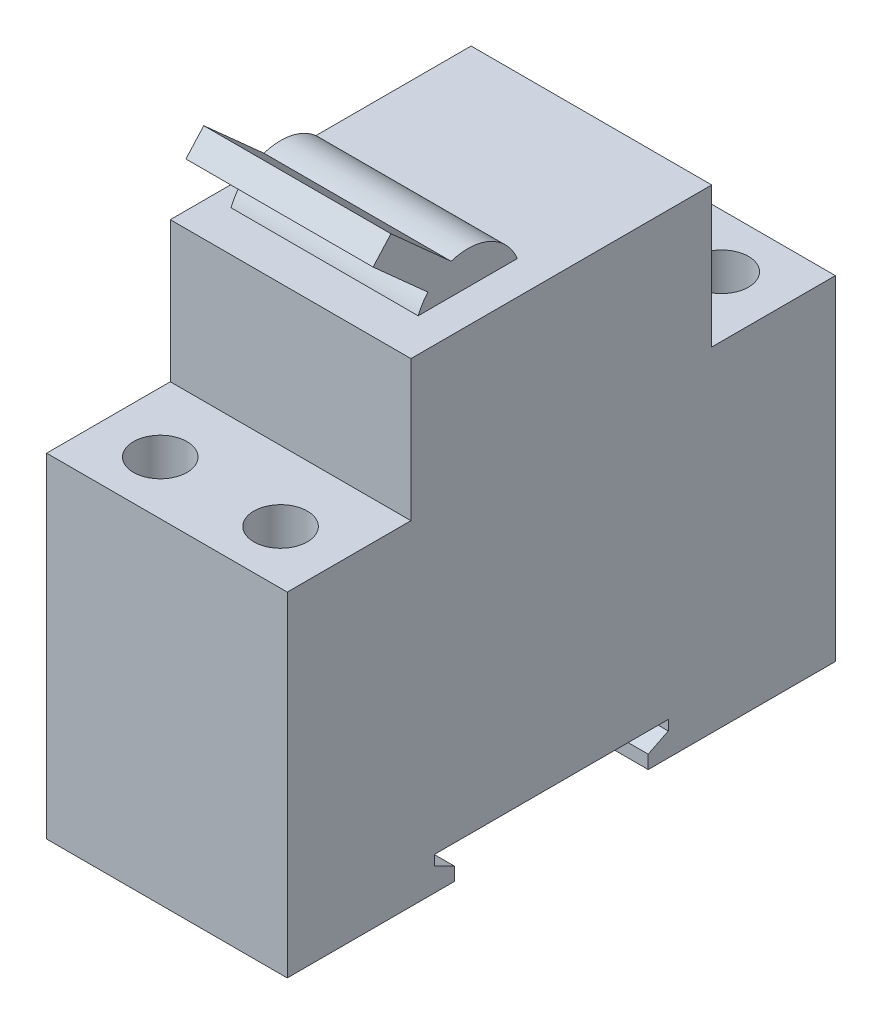
ISO-10303-21;
HEADER;
FILE_DESCRIPTION(('STEP AP214'),'2;1');
FILE_NAME('part.step','',(''),(''),'','','');
FILE_SCHEMA(('AUTOMOTIVE_DESIGN { 1 0 10303 214 1 1 1 1 }'));
ENDSEC;
DATA;
#1=APPLICATION_CONTEXT('core data for automotive mechanical design processes');
#2=APPLICATION_PROTOCOL_DEFINITION('international standard','automotive_design',2000,#1);
#3=PRODUCT_CONTEXT('',#1,'mechanical');
#4=PRODUCT('Part','Part','',(#3));
#5=PRODUCT_RELATED_PRODUCT_CATEGORY('part','',(#4));
#6=PRODUCT_DEFINITION_FORMATION('','',#4);
#7=PRODUCT_DEFINITION_CONTEXT('part definition',#1,'design');
#8=PRODUCT_DEFINITION('design','',#6,#7);
#9=PRODUCT_DEFINITION_SHAPE('','',#8);
#10=(LENGTH_UNIT() NAMED_UNIT(*) SI_UNIT(.MILLI.,.METRE.));
#11=(NAMED_UNIT(*) PLANE_ANGLE_UNIT() SI_UNIT($,.RADIAN.));
#12=(NAMED_UNIT(*) SI_UNIT($,.STERADIAN.) SOLID_ANGLE_UNIT());
#13=UNCERTAINTY_MEASURE_WITH_UNIT(LENGTH_MEASURE(1.E-05),#10,'distance_accuracy_value','');
#14=(GEOMETRIC_REPRESENTATION_CONTEXT(3) GLOBAL_UNCERTAINTY_ASSIGNED_CONTEXT((#13)) GLOBAL_UNIT_ASSIGNED_CONTEXT((#10,
#11,#12)) REPRESENTATION_CONTEXT('',''));
#15=CARTESIAN_POINT('',(0.,0.,0.));
#16=DIRECTION('',(0.,0.,1.));
#17=DIRECTION('',(1.,0.,0.));
#18=AXIS2_PLACEMENT_3D('',#15,#16,#17);
#19=CARTESIAN_POINT('',(36.,71.,-18.5));
#20=DIRECTION('',(0.,-1.,0.));
#21=DIRECTION('',(0.,0.,-1.));
#22=AXIS2_PLACEMENT_3D('',#19,#20,#21);
#23=PLANE('',#22);
#24=DIRECTION('',(0.,0.,1.));
#25=VECTOR('',#24,1.);
#26=CARTESIAN_POINT('',(0.,71.,-18.5));
#27=LINE('',#26,#25);
#28=CARTESIAN_POINT('',(0.,71.,-63.5));
#29=VERTEX_POINT('',#28);
#30=CARTESIAN_POINT('',(0.,71.,-18.5));
#31=VERTEX_POINT('',#30);
#32=EDGE_CURVE('E251',#29,#31,#27,.T.);
#33=ORIENTED_EDGE('',*,*,#32,.T.);
#34=DIRECTION('',(-1.,0.,0.));
#35=VECTOR('',#34,1.);
#36=CARTESIAN_POINT('',(36.,71.,-18.5));
#37=LINE('',#36,#35);
#38=CARTESIAN_POINT('',(36.,71.,-18.5));
#39=VERTEX_POINT('',#38);
#40=EDGE_CURVE('E299',#39,#31,#37,.T.);
#41=ORIENTED_EDGE('',*,*,#40,.F.);
#42=DIRECTION('',(0.,0.,1.));
#43=VECTOR('',#42,1.);
#44=CARTESIAN_POINT('',(36.,71.,-18.5));
#45=LINE('',#44,#43);
#46=CARTESIAN_POINT('',(36.,71.,-63.5));
#47=VERTEX_POINT('',#46);
#48=EDGE_CURVE('E283',#47,#39,#45,.T.);
#49=ORIENTED_EDGE('',*,*,#48,.F.);
#50=DIRECTION('',(-1.,0.,0.));
#51=VECTOR('',#50,1.);
#52=CARTESIAN_POINT('',(36.,71.,-63.5));
#53=LINE('',#52,#51);
#54=EDGE_CURVE('E302',#47,#29,#53,.T.);
#55=ORIENTED_EDGE('',*,*,#54,.T.);
#56=EDGE_LOOP('',(#33,#41,#49,#55));
#57=FACE_BOUND('',#56,.T.);
#58=DIRECTION('',(0.,0.,-1.));
#59=VECTOR('',#58,1.);
#60=CARTESIAN_POINT('',(31.,71.,-18.5));
#61=LINE('',#60,#59);
#62=CARTESIAN_POINT('',(31.,71.,-24.5838015129043));
#63=VERTEX_POINT('',#62);
#64=CARTESIAN_POINT('',(31.,71.,-39.4161984870957));
#65=VERTEX_POINT('',#64);
#66=EDGE_CURVE('E11',#63,#65,#61,.T.);
#67=ORIENTED_EDGE('',*,*,#66,.F.);
#68=DIRECTION('',(-1.,0.,0.));
#69=VECTOR('',#68,1.);
#70=CARTESIAN_POINT('',(31.,71.,-24.5838015129043));
#71=LINE('',#70,#69);
#72=CARTESIAN_POINT('',(3.,71.,-24.5838015129043));
#73=VERTEX_POINT('',#72);
#74=EDGE_CURVE('E41',#73,#63,#71,.F.);
#75=ORIENTED_EDGE('',*,*,#74,.F.);
#76=DIRECTION('',(0.,0.,-1.));
#77=VECTOR('',#76,1.);
#78=CARTESIAN_POINT('',(3.,71.,-18.5));
#79=LINE('',#78,#77);
#80=CARTESIAN_POINT('',(3.,71.,-39.4161984870957));
#81=VERTEX_POINT('',#80);
#82=EDGE_CURVE('E338',#73,#81,#79,.T.);
#83=ORIENTED_EDGE('',*,*,#82,.T.);
#84=DIRECTION('',(-1.,0.,0.));
#85=VECTOR('',#84,1.);
#86=CARTESIAN_POINT('',(31.,71.,-39.4161984870957));
#87=LINE('',#86,#85);
#88=EDGE_CURVE('E187',#65,#81,#87,.T.);
#89=ORIENTED_EDGE('',*,*,#88,.F.);
#90=EDGE_LOOP('',(#67,#75,#83,#89));
#91=FACE_BOUND('',#90,.T.);
#92=ADVANCED_FACE('F33',(#57,#91),#23,.F.);
#93=CARTESIAN_POINT('',(36.,0.,0.));
#94=DIRECTION('',(0.,1.,0.));
#95=DIRECTION('',(0.,0.,1.));
#96=AXIS2_PLACEMENT_3D('',#93,#94,#95);
#97=PLANE('',#96);
#98=DIRECTION('',(0.,0.,-1.));
#99=VECTOR('',#98,1.);
#100=CARTESIAN_POINT('',(0.,0.,0.));
#101=LINE('',#100,#99);
#102=CARTESIAN_POINT('',(0.,0.,0.));
#103=VERTEX_POINT('',#102);
#104=CARTESIAN_POINT('',(0.,0.,-25.));
#105=VERTEX_POINT('',#104);
#106=EDGE_CURVE('E197',#103,#105,#101,.T.);
#107=ORIENTED_EDGE('',*,*,#106,.T.);
#108=DIRECTION('',(-1.,0.,0.));
#109=VECTOR('',#108,1.);
#110=CARTESIAN_POINT('',(36.,0.,-25.));
#111=LINE('',#110,#109);
#112=CARTESIAN_POINT('',(36.,0.,-25.));
#113=VERTEX_POINT('',#112);
#114=EDGE_CURVE('E335',#113,#105,#111,.T.);
#115=ORIENTED_EDGE('',*,*,#114,.F.);
#116=DIRECTION('',(0.,0.,-1.));
#117=VECTOR('',#116,1.);
#118=CARTESIAN_POINT('',(36.,0.,0.));
#119=LINE('',#118,#117);
#120=CARTESIAN_POINT('',(36.,0.,0.));
#121=VERTEX_POINT('',#120);
#122=EDGE_CURVE('E259',#121,#113,#119,.T.);
#123=ORIENTED_EDGE('',*,*,#122,.F.);
#124=DIRECTION('',(-1.,0.,0.));
#125=VECTOR('',#124,1.);
#126=CARTESIAN_POINT('',(36.,0.,0.));
#127=LINE('',#126,#125);
#128=EDGE_CURVE('E290',#121,#103,#127,.T.);
#129=ORIENTED_EDGE('',*,*,#128,.T.);
#130=EDGE_LOOP('',(#107,#115,#123,#129));
#131=FACE_BOUND('',#130,.T.);
#132=ADVANCED_FACE('F35',(#131),#97,.F.);
#133=CARTESIAN_POINT('',(36.,0.,-25.));
#134=DIRECTION('',(0.,0.,1.));
#135=DIRECTION('',(1.,0.,0.));
#136=AXIS2_PLACEMENT_3D('',#133,#134,#135);
#137=PLANE('',#136);
#138=DIRECTION('',(0.,1.,0.));
#139=VECTOR('',#138,1.);
#140=CARTESIAN_POINT('',(0.,0.,-25.));
#141=LINE('',#140,#139);
#142=CARTESIAN_POINT('',(0.,2.,-25.));
#143=VERTEX_POINT('',#142);
#144=EDGE_CURVE('E229',#105,#143,#141,.T.);
#145=ORIENTED_EDGE('',*,*,#144,.T.);
#146=DIRECTION('',(-1.,0.,0.));
#147=VECTOR('',#146,1.);
#148=CARTESIAN_POINT('',(36.,2.,-25.));
#149=LINE('',#148,#147);
#150=CARTESIAN_POINT('',(36.,2.,-25.));
#151=VERTEX_POINT('',#150);
#152=EDGE_CURVE('E332',#151,#143,#149,.T.);
#153=ORIENTED_EDGE('',*,*,#152,.F.);
#154=DIRECTION('',(0.,1.,0.));
#155=VECTOR('',#154,1.);
#156=CARTESIAN_POINT('',(36.,0.,-25.));
#157=LINE('',#156,#155);
#158=EDGE_CURVE('E261',#113,#151,#157,.T.);
#159=ORIENTED_EDGE('',*,*,#158,.F.);
#160=ORIENTED_EDGE('',*,*,#114,.T.);
#161=EDGE_LOOP('',(#145,#153,#159,#160));
#162=FACE_BOUND('',#161,.T.);
#163=ADVANCED_FACE('F452',(#162),#137,.F.);
#164=CARTESIAN_POINT('',(36.,2.,-25.));
#165=DIRECTION('',(0.,-0.894427190999916,0.447213595499958));
#166=DIRECTION('',(0.,-0.447213595499958,-0.894427190999916));
#167=AXIS2_PLACEMENT_3D('',#164,#165,#166);
#168=PLANE('',#167);
#169=DIRECTION('',(0.,0.447213595499958,0.894427190999916));
#170=VECTOR('',#169,1.);
#171=CARTESIAN_POINT('',(0.,2.,-25.));
#172=LINE('',#171,#170);
#173=CARTESIAN_POINT('',(0.,3.5,-22.));
#174=VERTEX_POINT('',#173);
#175=EDGE_CURVE('E231',#143,#174,#172,.T.);
#176=ORIENTED_EDGE('',*,*,#175,.T.);
#177=DIRECTION('',(-1.,0.,0.));
#178=VECTOR('',#177,1.);
#179=CARTESIAN_POINT('',(36.,3.5,-22.));
#180=LINE('',#179,#178);
#181=CARTESIAN_POINT('',(36.,3.5,-22.));
#182=VERTEX_POINT('',#181);
#183=EDGE_CURVE('E329',#182,#174,#180,.T.);
#184=ORIENTED_EDGE('',*,*,#183,.F.);
#185=DIRECTION('',(0.,0.447213595499958,0.894427190999916));
#186=VECTOR('',#185,1.);
#187=CARTESIAN_POINT('',(36.,2.,-25.));
#188=LINE('',#187,#186);
#189=EDGE_CURVE('E263',#151,#182,#188,.T.);
#190=ORIENTED_EDGE('',*,*,#189,.F.);
#191=ORIENTED_EDGE('',*,*,#152,.T.);
#192=EDGE_LOOP('',(#176,#184,#190,#191));
#193=FACE_BOUND('',#192,.T.);
#194=ADVANCED_FACE('F448',(#193),#168,.F.);
#195=CARTESIAN_POINT('',(36.,3.5,-22.));
#196=DIRECTION('',(0.,0.,1.));
#197=DIRECTION('',(1.,0.,0.));
#198=AXIS2_PLACEMENT_3D('',#195,#196,#197);
#199=PLANE('',#198);
#200=DIRECTION('',(0.,1.,0.));
#201=VECTOR('',#200,1.);
#202=CARTESIAN_POINT('',(0.,3.5,-22.));
#203=LINE('',#202,#201);
#204=CARTESIAN_POINT('',(0.,5.,-22.));
#205=VERTEX_POINT('',#204);
#206=EDGE_CURVE('E233',#174,#205,#203,.T.);
#207=ORIENTED_EDGE('',*,*,#206,.T.);
#208=DIRECTION('',(-1.,0.,0.));
#209=VECTOR('',#208,1.);
#210=CARTESIAN_POINT('',(36.,5.,-22.));
#211=LINE('',#210,#209);
#212=CARTESIAN_POINT('',(36.,5.,-22.));
#213=VERTEX_POINT('',#212);
#214=EDGE_CURVE('E326',#213,#205,#211,.T.);
#215=ORIENTED_EDGE('',*,*,#214,.F.);
#216=DIRECTION('',(0.,1.,0.));
#217=VECTOR('',#216,1.);
#218=CARTESIAN_POINT('',(36.,3.5,-22.));
#219=LINE('',#218,#217);
#220=EDGE_CURVE('E265',#182,#213,#219,.T.);
#221=ORIENTED_EDGE('',*,*,#220,.F.);
#222=ORIENTED_EDGE('',*,*,#183,.T.);
#223=EDGE_LOOP('',(#207,#215,#221,#222));
#224=FACE_BOUND('',#223,.T.);
#225=ADVANCED_FACE('F444',(#224),#199,.F.);
#226=CARTESIAN_POINT('',(36.,5.,-22.));
#227=DIRECTION('',(0.,1.,0.));
#228=DIRECTION('',(0.,0.,1.));
#229=AXIS2_PLACEMENT_3D('',#226,#227,#228);
#230=PLANE('',#229);
#231=DIRECTION('',(0.,0.,-1.));
#232=VECTOR('',#231,1.);
#233=CARTESIAN_POINT('',(0.,5.,-22.));
#234=LINE('',#233,#232);
#235=CARTESIAN_POINT('',(0.,5.,-57.));
#236=VERTEX_POINT('',#235);
#237=EDGE_CURVE('E235',#205,#236,#234,.T.);
#238=ORIENTED_EDGE('',*,*,#237,.T.);
#239=DIRECTION('',(-1.,0.,0.));
#240=VECTOR('',#239,1.);
#241=CARTESIAN_POINT('',(36.,5.,-57.));
#242=LINE('',#241,#240);
#243=CARTESIAN_POINT('',(36.,5.,-57.));
#244=VERTEX_POINT('',#243);
#245=EDGE_CURVE('E323',#244,#236,#242,.T.);
#246=ORIENTED_EDGE('',*,*,#245,.F.);
#247=DIRECTION('',(0.,0.,-1.));
#248=VECTOR('',#247,1.);
#249=CARTESIAN_POINT('',(36.,5.,-22.));
#250=LINE('',#249,#248);
#251=EDGE_CURVE('E267',#213,#244,#250,.T.);
#252=ORIENTED_EDGE('',*,*,#251,.F.);
#253=ORIENTED_EDGE('',*,*,#214,.T.);
#254=EDGE_LOOP('',(#238,#246,#252,#253));
#255=FACE_BOUND('',#254,.T.);
#256=ADVANCED_FACE('F440',(#255),#230,.F.);
#257=CARTESIAN_POINT('',(36.,5.,-57.));
#258=DIRECTION('',(0.,0.,-1.));
#259=DIRECTION('',(0.,1.,0.));
#260=AXIS2_PLACEMENT_3D('',#257,#258,#259);
#261=PLANE('',#260);
#262=DIRECTION('',(0.,-1.,0.));
#263=VECTOR('',#262,1.);
#264=CARTESIAN_POINT('',(0.,5.,-57.));
#265=LINE('',#264,#263);
#266=CARTESIAN_POINT('',(0.,3.49999999999997,-57.));
#267=VERTEX_POINT('',#266);
#268=EDGE_CURVE('E237',#236,#267,#265,.T.);
#269=ORIENTED_EDGE('',*,*,#268,.T.);
#270=DIRECTION('',(-1.,0.,0.));
#271=VECTOR('',#270,1.);
#272=CARTESIAN_POINT('',(36.,3.49999999999997,-57.));
#273=LINE('',#272,#271);
#274=CARTESIAN_POINT('',(36.,3.49999999999997,-57.));
#275=VERTEX_POINT('',#274);
#276=EDGE_CURVE('E320',#275,#267,#273,.T.);
#277=ORIENTED_EDGE('',*,*,#276,.F.);
#278=DIRECTION('',(0.,-1.,0.));
#279=VECTOR('',#278,1.);
#280=CARTESIAN_POINT('',(36.,5.,-57.));
#281=LINE('',#280,#279);
#282=EDGE_CURVE('E269',#244,#275,#281,.T.);
#283=ORIENTED_EDGE('',*,*,#282,.F.);
#284=ORIENTED_EDGE('',*,*,#245,.T.);
#285=EDGE_LOOP('',(#269,#277,#283,#284));
#286=FACE_BOUND('',#285,.T.);
#287=ADVANCED_FACE('F435',(#286),#261,.F.);
#288=CARTESIAN_POINT('',(36.,3.49999999999997,-57.));
#289=DIRECTION('',(0.,-0.89442719099992,-0.447213595499949));
#290=DIRECTION('',(0.,0.447213595499949,-0.894427190999921));
#291=AXIS2_PLACEMENT_3D('',#288,#289,#290);
#292=PLANE('',#291);
#293=DIRECTION('',(0.,-0.447213595499949,0.89442719099992));
#294=VECTOR('',#293,1.);
#295=CARTESIAN_POINT('',(0.,3.49999999999997,-57.));
#296=LINE('',#295,#294);
#297=CARTESIAN_POINT('',(0.,2.,-54.));
#298=VERTEX_POINT('',#297);
#299=EDGE_CURVE('E239',#267,#298,#296,.T.);
#300=ORIENTED_EDGE('',*,*,#299,.T.);
#301=DIRECTION('',(-1.,0.,0.));
#302=VECTOR('',#301,1.);
#303=CARTESIAN_POINT('',(36.,2.,-54.));
#304=LINE('',#303,#302);
#305=CARTESIAN_POINT('',(36.,2.,-54.));
#306=VERTEX_POINT('',#305);
#307=EDGE_CURVE('E317',#306,#298,#304,.T.);
#308=ORIENTED_EDGE('',*,*,#307,.F.);
#309=DIRECTION('',(0.,-0.447213595499949,0.89442719099992));
#310=VECTOR('',#309,1.);
#311=CARTESIAN_POINT('',(36.,3.49999999999997,-57.));
#312=LINE('',#311,#310);
#313=EDGE_CURVE('E271',#275,#306,#312,.T.);
#314=ORIENTED_EDGE('',*,*,#313,.F.);
#315=ORIENTED_EDGE('',*,*,#276,.T.);
#316=EDGE_LOOP('',(#300,#308,#314,#315));
#317=FACE_BOUND('',#316,.T.);
#318=ADVANCED_FACE('F429',(#317),#292,.F.);
#319=CARTESIAN_POINT('',(36.,2.,-54.));
#320=DIRECTION('',(0.,0.,-1.));
#321=DIRECTION('',(0.,1.,0.));
#322=AXIS2_PLACEMENT_3D('',#319,#320,#321);
#323=PLANE('',#322);
#324=DIRECTION('',(0.,-1.,0.));
#325=VECTOR('',#324,1.);
#326=CARTESIAN_POINT('',(0.,2.,-54.));
#327=LINE('',#326,#325);
#328=CARTESIAN_POINT('',(0.,0.,-54.));
#329=VERTEX_POINT('',#328);
#330=EDGE_CURVE('E241',#298,#329,#327,.T.);
#331=ORIENTED_EDGE('',*,*,#330,.T.);
#332=DIRECTION('',(-1.,0.,0.));
#333=VECTOR('',#332,1.);
#334=CARTESIAN_POINT('',(36.,0.,-54.));
#335=LINE('',#334,#333);
#336=CARTESIAN_POINT('',(36.,0.,-54.));
#337=VERTEX_POINT('',#336);
#338=EDGE_CURVE('E314',#337,#329,#335,.T.);
#339=ORIENTED_EDGE('',*,*,#338,.F.);
#340=DIRECTION('',(0.,-1.,0.));
#341=VECTOR('',#340,1.);
#342=CARTESIAN_POINT('',(36.,2.,-54.));
#343=LINE('',#342,#341);
#344=EDGE_CURVE('E273',#306,#337,#343,.T.);
#345=ORIENTED_EDGE('',*,*,#344,.F.);
#346=ORIENTED_EDGE('',*,*,#307,.T.);
#347=EDGE_LOOP('',(#331,#339,#345,#346));
#348=FACE_BOUND('',#347,.T.);
#349=ADVANCED_FACE('F425',(#348),#323,.F.);
#350=CARTESIAN_POINT('',(36.,0.,-82.));
#351=DIRECTION('',(0.,1.,0.));
#352=DIRECTION('',(0.,0.,1.));
#353=AXIS2_PLACEMENT_3D('',#350,#351,#352);
#354=PLANE('',#353);
#355=DIRECTION('',(0.,0.,-1.));
#356=VECTOR('',#355,1.);
#357=CARTESIAN_POINT('',(0.,0.,-82.));
#358=LINE('',#357,#356);
#359=CARTESIAN_POINT('',(0.,0.,-82.));
#360=VERTEX_POINT('',#359);
#361=EDGE_CURVE('E243',#329,#360,#358,.T.);
#362=ORIENTED_EDGE('',*,*,#361,.T.);
#363=DIRECTION('',(-1.,0.,0.));
#364=VECTOR('',#363,1.);
#365=CARTESIAN_POINT('',(36.,0.,-82.));
#366=LINE('',#365,#364);
#367=CARTESIAN_POINT('',(36.,0.,-82.));
#368=VERTEX_POINT('',#367);
#369=EDGE_CURVE('E311',#368,#360,#366,.T.);
#370=ORIENTED_EDGE('',*,*,#369,.F.);
#371=DIRECTION('',(0.,0.,-1.));
#372=VECTOR('',#371,1.);
#373=CARTESIAN_POINT('',(36.,0.,-82.));
#374=LINE('',#373,#372);
#375=EDGE_CURVE('E275',#337,#368,#374,.T.);
#376=ORIENTED_EDGE('',*,*,#375,.F.);
#377=ORIENTED_EDGE('',*,*,#338,.T.);
#378=EDGE_LOOP('',(#362,#370,#376,#377));
#379=FACE_BOUND('',#378,.T.);
#380=ADVANCED_FACE('F421',(#379),#354,.F.);
#381=CARTESIAN_POINT('',(36.,50.,-82.));
#382=DIRECTION('',(0.,0.,1.));
#383=DIRECTION('',(0.,-1.,0.));
#384=AXIS2_PLACEMENT_3D('',#381,#382,#383);
#385=PLANE('',#384);
#386=DIRECTION('',(0.,1.,0.));
#387=VECTOR('',#386,1.);
#388=CARTESIAN_POINT('',(0.,50.,-82.));
#389=LINE('',#388,#387);
#390=CARTESIAN_POINT('',(0.,50.,-82.));
#391=VERTEX_POINT('',#390);
#392=EDGE_CURVE('E245',#360,#391,#389,.T.);
#393=ORIENTED_EDGE('',*,*,#392,.T.);
#394=DIRECTION('',(-1.,0.,0.));
#395=VECTOR('',#394,1.);
#396=CARTESIAN_POINT('',(36.,50.,-82.));
#397=LINE('',#396,#395);
#398=CARTESIAN_POINT('',(36.,50.,-82.));
#399=VERTEX_POINT('',#398);
#400=EDGE_CURVE('E308',#399,#391,#397,.T.);
#401=ORIENTED_EDGE('',*,*,#400,.F.);
#402=DIRECTION('',(0.,1.,0.));
#403=VECTOR('',#402,1.);
#404=CARTESIAN_POINT('',(36.,50.,-82.));
#405=LINE('',#404,#403);
#406=EDGE_CURVE('E277',#368,#399,#405,.T.);
#407=ORIENTED_EDGE('',*,*,#406,.F.);
#408=ORIENTED_EDGE('',*,*,#369,.T.);
#409=EDGE_LOOP('',(#393,#401,#407,#408));
#410=FACE_BOUND('',#409,.T.);
#411=ADVANCED_FACE('F384',(#410),#385,.F.);
#412=CARTESIAN_POINT('',(36.,50.,-63.5));
#413=DIRECTION('',(0.,-1.,0.));
#414=DIRECTION('',(0.,0.,-1.));
#415=AXIS2_PLACEMENT_3D('',#412,#413,#414);
#416=PLANE('',#415);
#417=CARTESIAN_POINT('',(27.,50.,-74.));
#418=DIRECTION('',(0.,1.,0.));
#419=DIRECTION('',(0.,0.,1.));
#420=AXIS2_PLACEMENT_3D('',#417,#418,#419);
#421=CIRCLE('',#420,4.);
#422=CARTESIAN_POINT('',(27.,50.,-70.));
#423=VERTEX_POINT('',#422);
#424=EDGE_CURVE('E374',#423,#423,#421,.T.);
#425=ORIENTED_EDGE('',*,*,#424,.F.);
#426=EDGE_LOOP('',(#425));
#427=FACE_BOUND('',#426,.T.);
#428=CARTESIAN_POINT('',(9.,50.,-74.));
#429=DIRECTION('',(0.,1.,0.));
#430=DIRECTION('',(0.,0.,1.));
#431=AXIS2_PLACEMENT_3D('',#428,#429,#430);
#432=CIRCLE('',#431,4.00000000000001);
#433=CARTESIAN_POINT('',(9.,50.,-70.));
#434=VERTEX_POINT('',#433);
#435=EDGE_CURVE('E368',#434,#434,#432,.T.);
#436=ORIENTED_EDGE('',*,*,#435,.F.);
#437=EDGE_LOOP('',(#436));
#438=FACE_BOUND('',#437,.T.);
#439=DIRECTION('',(0.,0.,1.));
#440=VECTOR('',#439,1.);
#441=CARTESIAN_POINT('',(0.,50.,-63.5));
#442=LINE('',#441,#440);
#443=CARTESIAN_POINT('',(0.,50.,-63.5));
#444=VERTEX_POINT('',#443);
#445=EDGE_CURVE('E247',#391,#444,#442,.T.);
#446=ORIENTED_EDGE('',*,*,#445,.T.);
#447=DIRECTION('',(-1.,0.,0.));
#448=VECTOR('',#447,1.);
#449=CARTESIAN_POINT('',(36.,50.,-63.5));
#450=LINE('',#449,#448);
#451=CARTESIAN_POINT('',(36.,50.,-63.5));
#452=VERTEX_POINT('',#451);
#453=EDGE_CURVE('E305',#452,#444,#450,.T.);
#454=ORIENTED_EDGE('',*,*,#453,.F.);
#455=DIRECTION('',(0.,0.,1.));
#456=VECTOR('',#455,1.);
#457=CARTESIAN_POINT('',(36.,50.,-63.5));
#458=LINE('',#457,#456);
#459=EDGE_CURVE('E279',#399,#452,#458,.T.);
#460=ORIENTED_EDGE('',*,*,#459,.F.);
#461=ORIENTED_EDGE('',*,*,#400,.T.);
#462=EDGE_LOOP('',(#446,#454,#460,#461));
#463=FACE_BOUND('',#462,.T.);
#464=ADVANCED_FACE('F380',(#427,#438,#463),#416,.F.);
#465=CARTESIAN_POINT('',(36.,71.,-63.5));
#466=DIRECTION('',(0.,0.,1.));
#467=DIRECTION('',(1.,0.,0.));
#468=AXIS2_PLACEMENT_3D('',#465,#466,#467);
#469=PLANE('',#468);
#470=DIRECTION('',(0.,1.,0.));
#471=VECTOR('',#470,1.);
#472=CARTESIAN_POINT('',(0.,71.,-63.5));
#473=LINE('',#472,#471);
#474=EDGE_CURVE('E249',#444,#29,#473,.T.);
#475=ORIENTED_EDGE('',*,*,#474,.T.);
#476=ORIENTED_EDGE('',*,*,#54,.F.);
#477=DIRECTION('',(0.,1.,0.));
#478=VECTOR('',#477,1.);
#479=CARTESIAN_POINT('',(36.,71.,-63.5));
#480=LINE('',#479,#478);
#481=EDGE_CURVE('E281',#452,#47,#480,.T.);
#482=ORIENTED_EDGE('',*,*,#481,.F.);
#483=ORIENTED_EDGE('',*,*,#453,.T.);
#484=EDGE_LOOP('',(#475,#476,#482,#483));
#485=FACE_BOUND('',#484,.T.);
#486=ADVANCED_FACE('F383',(#485),#469,.F.);
#487=CARTESIAN_POINT('',(36.,50.,-18.5));
#488=DIRECTION('',(0.,0.,-1.));
#489=DIRECTION('',(-1.,0.,0.));
#490=AXIS2_PLACEMENT_3D('',#487,#488,#489);
#491=PLANE('',#490);
#492=DIRECTION('',(0.,-1.,0.));
#493=VECTOR('',#492,1.);
#494=CARTESIAN_POINT('',(0.,50.,-18.5));
#495=LINE('',#494,#493);
#496=CARTESIAN_POINT('',(0.,50.,-18.5));
#497=VERTEX_POINT('',#496);
#498=EDGE_CURVE('E253',#31,#497,#495,.T.);
#499=ORIENTED_EDGE('',*,*,#498,.T.);
#500=DIRECTION('',(-1.,0.,0.));
#501=VECTOR('',#500,1.);
#502=CARTESIAN_POINT('',(36.,50.,-18.5));
#503=LINE('',#502,#501);
#504=CARTESIAN_POINT('',(36.,50.,-18.5));
#505=VERTEX_POINT('',#504);
#506=EDGE_CURVE('E296',#505,#497,#503,.T.);
#507=ORIENTED_EDGE('',*,*,#506,.F.);
#508=DIRECTION('',(0.,-1.,0.));
#509=VECTOR('',#508,1.);
#510=CARTESIAN_POINT('',(36.,50.,-18.5));
#511=LINE('',#510,#509);
#512=EDGE_CURVE('E285',#39,#505,#511,.T.);
#513=ORIENTED_EDGE('',*,*,#512,.F.);
#514=ORIENTED_EDGE('',*,*,#40,.T.);
#515=EDGE_LOOP('',(#499,#507,#513,#514));
#516=FACE_BOUND('',#515,.T.);
#517=ADVANCED_FACE('F408',(#516),#491,.F.);
#518=CARTESIAN_POINT('',(36.,50.,0.));
#519=DIRECTION('',(0.,-1.,0.));
#520=DIRECTION('',(0.,0.,-1.));
#521=AXIS2_PLACEMENT_3D('',#518,#519,#520);
#522=PLANE('',#521);
#523=CARTESIAN_POINT('',(27.,50.,-8.));
#524=DIRECTION('',(0.,1.,0.));
#525=DIRECTION('',(0.,0.,1.));
#526=AXIS2_PLACEMENT_3D('',#523,#524,#525);
#527=CIRCLE('',#526,4.);
#528=CARTESIAN_POINT('',(27.,50.,-4.));
#529=VERTEX_POINT('',#528);
#530=EDGE_CURVE('E362',#529,#529,#527,.T.);
#531=ORIENTED_EDGE('',*,*,#530,.F.);
#532=EDGE_LOOP('',(#531));
#533=FACE_BOUND('',#532,.T.);
#534=CARTESIAN_POINT('',(9.,50.,-8.));
#535=DIRECTION('',(0.,1.,0.));
#536=DIRECTION('',(0.,0.,1.));
#537=AXIS2_PLACEMENT_3D('',#534,#535,#536);
#538=CIRCLE('',#537,4.);
#539=CARTESIAN_POINT('',(9.,50.,-4.));
#540=VERTEX_POINT('',#539);
#541=EDGE_CURVE('E354',#540,#540,#538,.T.);
#542=ORIENTED_EDGE('',*,*,#541,.F.);
#543=EDGE_LOOP('',(#542));
#544=FACE_BOUND('',#543,.T.);
#545=DIRECTION('',(0.,0.,1.));
#546=VECTOR('',#545,1.);
#547=CARTESIAN_POINT('',(0.,50.,0.));
#548=LINE('',#547,#546);
#549=CARTESIAN_POINT('',(0.,50.,0.));
#550=VERTEX_POINT('',#549);
#551=EDGE_CURVE('E255',#497,#550,#548,.T.);
#552=ORIENTED_EDGE('',*,*,#551,.T.);
#553=DIRECTION('',(-1.,0.,0.));
#554=VECTOR('',#553,1.);
#555=CARTESIAN_POINT('',(36.,50.,0.));
#556=LINE('',#555,#554);
#557=CARTESIAN_POINT('',(36.,50.,0.));
#558=VERTEX_POINT('',#557);
#559=EDGE_CURVE('E293',#558,#550,#556,.T.);
#560=ORIENTED_EDGE('',*,*,#559,.F.);
#561=DIRECTION('',(0.,0.,1.));
#562=VECTOR('',#561,1.);
#563=CARTESIAN_POINT('',(36.,50.,0.));
#564=LINE('',#563,#562);
#565=EDGE_CURVE('E287',#505,#558,#564,.T.);
#566=ORIENTED_EDGE('',*,*,#565,.F.);
#567=ORIENTED_EDGE('',*,*,#506,.T.);
#568=EDGE_LOOP('',(#552,#560,#566,#567));
#569=FACE_BOUND('',#568,.T.);
#570=ADVANCED_FACE('F460',(#533,#544,#569),#522,.F.);
#571=CARTESIAN_POINT('',(36.,0.,0.));
#572=DIRECTION('',(0.,0.,-1.));
#573=DIRECTION('',(-1.,0.,0.));
#574=AXIS2_PLACEMENT_3D('',#571,#572,#573);
#575=PLANE('',#574);
#576=DIRECTION('',(0.,-1.,0.));
#577=VECTOR('',#576,1.);
#578=CARTESIAN_POINT('',(0.,0.,0.));
#579=LINE('',#578,#577);
#580=EDGE_CURVE('E257',#550,#103,#579,.T.);
#581=ORIENTED_EDGE('',*,*,#580,.T.);
#582=ORIENTED_EDGE('',*,*,#128,.F.);
#583=DIRECTION('',(0.,-1.,0.));
#584=VECTOR('',#583,1.);
#585=CARTESIAN_POINT('',(36.,0.,0.));
#586=LINE('',#585,#584);
#587=EDGE_CURVE('E56',#558,#121,#586,.T.);
#588=ORIENTED_EDGE('',*,*,#587,.F.);
#589=ORIENTED_EDGE('',*,*,#559,.T.);
#590=EDGE_LOOP('',(#581,#582,#588,#589));
#591=FACE_BOUND('',#590,.T.);
#592=ADVANCED_FACE('F458',(#591),#575,.F.);
#593=CARTESIAN_POINT('',(36.,0.,-25.));
#594=DIRECTION('',(1.,0.,0.));
#595=DIRECTION('',(0.,0.,-1.));
#596=AXIS2_PLACEMENT_3D('',#593,#594,#595);
#597=PLANE('',#596);
#598=ORIENTED_EDGE('',*,*,#122,.T.);
#599=ORIENTED_EDGE('',*,*,#158,.T.);
#600=ORIENTED_EDGE('',*,*,#189,.T.);
#601=ORIENTED_EDGE('',*,*,#220,.T.);
#602=ORIENTED_EDGE('',*,*,#251,.T.);
#603=ORIENTED_EDGE('',*,*,#282,.T.);
#604=ORIENTED_EDGE('',*,*,#313,.T.);
#605=ORIENTED_EDGE('',*,*,#344,.T.);
#606=ORIENTED_EDGE('',*,*,#375,.T.);
#607=ORIENTED_EDGE('',*,*,#406,.T.);
#608=ORIENTED_EDGE('',*,*,#459,.T.);
#609=ORIENTED_EDGE('',*,*,#481,.T.);
#610=ORIENTED_EDGE('',*,*,#48,.T.);
#611=ORIENTED_EDGE('',*,*,#512,.T.);
#612=ORIENTED_EDGE('',*,*,#565,.T.);
#613=ORIENTED_EDGE('',*,*,#587,.T.);
#614=EDGE_LOOP('',(#598,#599,#600,#601,#602,#603,#604,#605,#606,#607,#608,#609,#610,#611,#612,#613));
#615=FACE_BOUND('',#614,.T.);
#616=ADVANCED_FACE('F411',(#615),#597,.T.);
#617=CARTESIAN_POINT('',(0.,0.,-25.));
#618=DIRECTION('',(1.,0.,0.));
#619=DIRECTION('',(0.,0.,-1.));
#620=AXIS2_PLACEMENT_3D('',#617,#618,#619);
#621=PLANE('',#620);
#622=ORIENTED_EDGE('',*,*,#106,.F.);
#623=ORIENTED_EDGE('',*,*,#580,.F.);
#624=ORIENTED_EDGE('',*,*,#551,.F.);
#625=ORIENTED_EDGE('',*,*,#498,.F.);
#626=ORIENTED_EDGE('',*,*,#32,.F.);
#627=ORIENTED_EDGE('',*,*,#474,.F.);
#628=ORIENTED_EDGE('',*,*,#445,.F.);
#629=ORIENTED_EDGE('',*,*,#392,.F.);
#630=ORIENTED_EDGE('',*,*,#361,.F.);
#631=ORIENTED_EDGE('',*,*,#330,.F.);
#632=ORIENTED_EDGE('',*,*,#299,.F.);
#633=ORIENTED_EDGE('',*,*,#268,.F.);
#634=ORIENTED_EDGE('',*,*,#237,.F.);
#635=ORIENTED_EDGE('',*,*,#206,.F.);
#636=ORIENTED_EDGE('',*,*,#175,.F.);
#637=ORIENTED_EDGE('',*,*,#144,.F.);
#638=EDGE_LOOP('',(#622,#623,#624,#625,#626,#627,#628,#629,#630,#631,#632,#633,#634,#635,#636,#637));
#639=FACE_BOUND('',#638,.T.);
#640=ADVANCED_FACE('F400',(#639),#621,.F.);
#641=CARTESIAN_POINT('',(31.,68.,-32.));
#642=DIRECTION('',(-1.,0.,0.));
#643=DIRECTION('',(0.,0.,1.));
#644=AXIS2_PLACEMENT_3D('',#641,#642,#643);
#645=CYLINDRICAL_SURFACE('',#644,8.);
#646=CARTESIAN_POINT('',(3.,68.,-32.));
#647=DIRECTION('',(1.,0.,0.));
#648=DIRECTION('',(0.,0.,1.));
#649=AXIS2_PLACEMENT_3D('',#646,#647,#648);
#650=CIRCLE('',#649,8.);
#651=CARTESIAN_POINT('',(3.,73.3389073003454,-26.0421422609868));
#652=VERTEX_POINT('',#651);
#653=EDGE_CURVE('E190',#652,#73,#650,.T.);
#654=ORIENTED_EDGE('',*,*,#653,.T.);
#655=ORIENTED_EDGE('',*,*,#74,.T.);
#656=CARTESIAN_POINT('',(31.,68.,-32.));
#657=DIRECTION('',(1.,0.,0.));
#658=DIRECTION('',(0.,0.,1.));
#659=AXIS2_PLACEMENT_3D('',#656,#657,#658);
#660=CIRCLE('',#659,8.);
#661=CARTESIAN_POINT('',(31.,73.3389073003454,-26.0421422609868));
#662=VERTEX_POINT('',#661);
#663=EDGE_CURVE('E210',#662,#63,#660,.T.);
#664=ORIENTED_EDGE('',*,*,#663,.F.);
#665=DIRECTION('',(-1.,0.,0.));
#666=VECTOR('',#665,1.);
#667=CARTESIAN_POINT('',(31.,73.3389073003454,-26.0421422609868));
#668=LINE('',#667,#666);
#669=EDGE_CURVE('E220',#662,#652,#668,.T.);
#670=ORIENTED_EDGE('',*,*,#669,.T.);
#671=EDGE_LOOP('',(#654,#655,#664,#670));
#672=FACE_BOUND('',#671,.T.);
#673=ADVANCED_FACE('F344',(#672),#645,.T.);
#674=CARTESIAN_POINT('',(31.,68.,-32.));
#675=DIRECTION('',(-1.,0.,0.));
#676=DIRECTION('',(0.,0.,1.));
#677=AXIS2_PLACEMENT_3D('',#674,#675,#676);
#678=CYLINDRICAL_SURFACE('',#677,8.);
#679=CARTESIAN_POINT('',(31.,68.,-32.));
#680=DIRECTION('',(1.,0.,0.));
#681=DIRECTION('',(0.,0.,1.));
#682=AXIS2_PLACEMENT_3D('',#679,#680,#681);
#683=CIRCLE('',#682,8.);
#684=CARTESIAN_POINT('',(31.,75.6034687241735,-29.5125789740143));
#685=VERTEX_POINT('',#684);
#686=EDGE_CURVE('E213',#65,#685,#683,.T.);
#687=ORIENTED_EDGE('',*,*,#686,.F.);
#688=ORIENTED_EDGE('',*,*,#88,.T.);
#689=CARTESIAN_POINT('',(3.,68.,-32.));
#690=DIRECTION('',(1.,0.,0.));
#691=DIRECTION('',(0.,0.,1.));
#692=AXIS2_PLACEMENT_3D('',#689,#690,#691);
#693=CIRCLE('',#692,8.);
#694=CARTESIAN_POINT('',(3.,75.6034687241735,-29.5125789740143));
#695=VERTEX_POINT('',#694);
#696=EDGE_CURVE('E48',#81,#695,#693,.T.);
#697=ORIENTED_EDGE('',*,*,#696,.T.);
#698=DIRECTION('',(-1.,0.,0.));
#699=VECTOR('',#698,1.);
#700=CARTESIAN_POINT('',(31.,75.6034687241735,-29.5125789740143));
#701=LINE('',#700,#699);
#702=EDGE_CURVE('E184',#685,#695,#701,.T.);
#703=ORIENTED_EDGE('',*,*,#702,.F.);
#704=EDGE_LOOP('',(#687,#688,#697,#703));
#705=FACE_BOUND('',#704,.T.);
#706=ADVANCED_FACE('F183',(#705),#678,.T.);
#707=CARTESIAN_POINT('',(31.,68.,-32.));
#708=DIRECTION('',(-1.,0.,0.));
#709=DIRECTION('',(0.,0.,1.));
#710=AXIS2_PLACEMENT_3D('',#707,#708,#709);
#711=PLANE('',#710);
#712=ORIENTED_EDGE('',*,*,#663,.T.);
#713=ORIENTED_EDGE('',*,*,#66,.T.);
#714=ORIENTED_EDGE('',*,*,#686,.T.);
#715=DIRECTION('',(0.,0.66736341254317,0.744732217376645));
#716=VECTOR('',#715,1.);
#717=CARTESIAN_POINT('',(31.,83.6700984890429,-20.5107683283655));
#718=LINE('',#717,#716);
#719=CARTESIAN_POINT('',(31.,83.6700984890429,-20.5107683283655));
#720=VERTEX_POINT('',#719);
#721=EDGE_CURVE('E196',#685,#720,#718,.T.);
#722=ORIENTED_EDGE('',*,*,#721,.T.);
#723=DIRECTION('',(0.,-0.744732217376645,0.66736341254317));
#724=VECTOR('',#723,1.);
#725=CARTESIAN_POINT('',(31.,80.6892822160993,-17.8396233534868));
#726=LINE('',#725,#724);
#727=CARTESIAN_POINT('',(31.,80.6892822160993,-17.8396233534868));
#728=VERTEX_POINT('',#727);
#729=EDGE_CURVE('E216',#720,#728,#726,.T.);
#730=ORIENTED_EDGE('',*,*,#729,.T.);
#731=DIRECTION('',(0.,-0.66736341254317,-0.744732217376645));
#732=VECTOR('',#731,1.);
#733=CARTESIAN_POINT('',(31.,73.3389073003454,-26.0421422609868));
#734=LINE('',#733,#732);
#735=EDGE_CURVE('E218',#728,#662,#734,.T.);
#736=ORIENTED_EDGE('',*,*,#735,.T.);
#737=EDGE_LOOP('',(#712,#713,#714,#722,#730,#736));
#738=FACE_BOUND('',#737,.T.);
#739=ADVANCED_FACE('F349',(#738),#711,.F.);
#740=CARTESIAN_POINT('',(3.,68.,-32.));
#741=DIRECTION('',(-1.,0.,0.));
#742=DIRECTION('',(0.,0.,1.));
#743=AXIS2_PLACEMENT_3D('',#740,#741,#742);
#744=PLANE('',#743);
#745=ORIENTED_EDGE('',*,*,#82,.F.);
#746=ORIENTED_EDGE('',*,*,#653,.F.);
#747=DIRECTION('',(0.,-0.66736341254317,-0.744732217376645));
#748=VECTOR('',#747,1.);
#749=CARTESIAN_POINT('',(3.,73.3389073003454,-26.0421422609868));
#750=LINE('',#749,#748);
#751=CARTESIAN_POINT('',(3.,80.6892822160993,-17.8396233534868));
#752=VERTEX_POINT('',#751);
#753=EDGE_CURVE('E205',#752,#652,#750,.T.);
#754=ORIENTED_EDGE('',*,*,#753,.F.);
#755=DIRECTION('',(0.,-0.744732217376645,0.66736341254317));
#756=VECTOR('',#755,1.);
#757=CARTESIAN_POINT('',(3.,80.6892822160993,-17.8396233534868));
#758=LINE('',#757,#756);
#759=CARTESIAN_POINT('',(3.,83.6700984890429,-20.5107683283655));
#760=VERTEX_POINT('',#759);
#761=EDGE_CURVE('E203',#760,#752,#758,.T.);
#762=ORIENTED_EDGE('',*,*,#761,.F.);
#763=DIRECTION('',(0.,0.66736341254317,0.744732217376645));
#764=VECTOR('',#763,1.);
#765=CARTESIAN_POINT('',(3.,83.6700984890429,-20.5107683283655));
#766=LINE('',#765,#764);
#767=EDGE_CURVE('E189',#695,#760,#766,.T.);
#768=ORIENTED_EDGE('',*,*,#767,.F.);
#769=ORIENTED_EDGE('',*,*,#696,.F.);
#770=EDGE_LOOP('',(#745,#746,#754,#762,#768,#769));
#771=FACE_BOUND('',#770,.T.);
#772=ADVANCED_FACE('F201',(#771),#744,.T.);
#773=CARTESIAN_POINT('',(31.,83.6700984890429,-20.5107683283655));
#774=DIRECTION('',(0.,-0.744732217376645,0.66736341254317));
#775=DIRECTION('',(0.,-0.66736341254317,-0.744732217376645));
#776=AXIS2_PLACEMENT_3D('',#773,#774,#775);
#777=PLANE('',#776);
#778=ORIENTED_EDGE('',*,*,#767,.T.);
#779=DIRECTION('',(-1.,0.,0.));
#780=VECTOR('',#779,1.);
#781=CARTESIAN_POINT('',(31.,83.6700984890429,-20.5107683283655));
#782=LINE('',#781,#780);
#783=EDGE_CURVE('E198',#720,#760,#782,.T.);
#784=ORIENTED_EDGE('',*,*,#783,.F.);
#785=ORIENTED_EDGE('',*,*,#721,.F.);
#786=ORIENTED_EDGE('',*,*,#702,.T.);
#787=EDGE_LOOP('',(#778,#784,#785,#786));
#788=FACE_BOUND('',#787,.T.);
#789=ADVANCED_FACE('F193',(#788),#777,.F.);
#790=CARTESIAN_POINT('',(31.,80.6892822160993,-17.8396233534868));
#791=DIRECTION('',(0.,-0.66736341254317,-0.744732217376645));
#792=DIRECTION('',(0.,0.744732217376645,-0.66736341254317));
#793=AXIS2_PLACEMENT_3D('',#790,#791,#792);
#794=PLANE('',#793);
#795=ORIENTED_EDGE('',*,*,#761,.T.);
#796=DIRECTION('',(-1.,0.,0.));
#797=VECTOR('',#796,1.);
#798=CARTESIAN_POINT('',(31.,80.6892822160993,-17.8396233534868));
#799=LINE('',#798,#797);
#800=EDGE_CURVE('E223',#728,#752,#799,.T.);
#801=ORIENTED_EDGE('',*,*,#800,.F.);
#802=ORIENTED_EDGE('',*,*,#729,.F.);
#803=ORIENTED_EDGE('',*,*,#783,.T.);
#804=EDGE_LOOP('',(#795,#801,#802,#803));
#805=FACE_BOUND('',#804,.T.);
#806=ADVANCED_FACE('F612',(#805),#794,.F.);
#807=CARTESIAN_POINT('',(31.,73.3389073003454,-26.0421422609868));
#808=DIRECTION('',(0.,0.744732217376645,-0.66736341254317));
#809=DIRECTION('',(0.,0.66736341254317,0.744732217376645));
#810=AXIS2_PLACEMENT_3D('',#807,#808,#809);
#811=PLANE('',#810);
#812=ORIENTED_EDGE('',*,*,#753,.T.);
#813=ORIENTED_EDGE('',*,*,#669,.F.);
#814=ORIENTED_EDGE('',*,*,#735,.F.);
#815=ORIENTED_EDGE('',*,*,#800,.T.);
#816=EDGE_LOOP('',(#812,#813,#814,#815));
#817=FACE_BOUND('',#816,.T.);
#818=ADVANCED_FACE('F621',(#817),#811,.F.);
#819=CARTESIAN_POINT('',(9.,40.,-8.));
#820=DIRECTION('',(0.,1.,0.));
#821=DIRECTION('',(0.,0.,1.));
#822=AXIS2_PLACEMENT_3D('',#819,#820,#821);
#823=CYLINDRICAL_SURFACE('',#822,4.);
#824=CARTESIAN_POINT('',(9.,40.,-8.));
#825=DIRECTION('',(0.,1.,0.));
#826=DIRECTION('',(0.,0.,1.));
#827=AXIS2_PLACEMENT_3D('',#824,#825,#826);
#828=CIRCLE('',#827,4.);
#829=CARTESIAN_POINT('',(9.,40.,-4.));
#830=VERTEX_POINT('',#829);
#831=EDGE_CURVE('E352',#830,#830,#828,.T.);
#832=ORIENTED_EDGE('',*,*,#831,.F.);
#833=EDGE_LOOP('',(#832));
#834=FACE_BOUND('',#833,.T.);
#835=ORIENTED_EDGE('',*,*,#541,.T.);
#836=EDGE_LOOP('',(#835));
#837=FACE_BOUND('',#836,.T.);
#838=ADVANCED_FACE('F631',(#834,#837),#823,.F.);
#839=CARTESIAN_POINT('',(9.,40.,-8.));
#840=DIRECTION('',(0.,1.,0.));
#841=DIRECTION('',(0.,0.,1.));
#842=AXIS2_PLACEMENT_3D('',#839,#840,#841);
#843=PLANE('',#842);
#844=ORIENTED_EDGE('',*,*,#831,.T.);
#845=EDGE_LOOP('',(#844));
#846=FACE_BOUND('',#845,.T.);
#847=ADVANCED_FACE('F641',(#846),#843,.T.);
#848=CARTESIAN_POINT('',(27.,40.,-8.));
#849=DIRECTION('',(0.,1.,0.));
#850=DIRECTION('',(0.,0.,1.));
#851=AXIS2_PLACEMENT_3D('',#848,#849,#850);
#852=CYLINDRICAL_SURFACE('',#851,4.);
#853=CARTESIAN_POINT('',(27.,40.,-8.));
#854=DIRECTION('',(0.,1.,0.));
#855=DIRECTION('',(0.,0.,1.));
#856=AXIS2_PLACEMENT_3D('',#853,#854,#855);
#857=CIRCLE('',#856,4.);
#858=CARTESIAN_POINT('',(27.,40.,-4.));
#859=VERTEX_POINT('',#858);
#860=EDGE_CURVE('E359',#859,#859,#857,.T.);
#861=ORIENTED_EDGE('',*,*,#860,.F.);
#862=EDGE_LOOP('',(#861));
#863=FACE_BOUND('',#862,.T.);
#864=ORIENTED_EDGE('',*,*,#530,.T.);
#865=EDGE_LOOP('',(#864));
#866=FACE_BOUND('',#865,.T.);
#867=ADVANCED_FACE('F651',(#863,#866),#852,.F.);
#868=CARTESIAN_POINT('',(27.,40.,-8.));
#869=DIRECTION('',(0.,1.,0.));
#870=DIRECTION('',(0.,0.,1.));
#871=AXIS2_PLACEMENT_3D('',#868,#869,#870);
#872=PLANE('',#871);
#873=ORIENTED_EDGE('',*,*,#860,.T.);
#874=EDGE_LOOP('',(#873));
#875=FACE_BOUND('',#874,.T.);
#876=ADVANCED_FACE('F661',(#875),#872,.T.);
#877=CARTESIAN_POINT('',(9.,40.,-74.));
#878=DIRECTION('',(0.,1.,0.));
#879=DIRECTION('',(0.,0.,1.));
#880=AXIS2_PLACEMENT_3D('',#877,#878,#879);
#881=CYLINDRICAL_SURFACE('',#880,4.00000000000001);
#882=CARTESIAN_POINT('',(9.,40.,-74.));
#883=DIRECTION('',(0.,1.,0.));
#884=DIRECTION('',(0.,0.,1.));
#885=AXIS2_PLACEMENT_3D('',#882,#883,#884);
#886=CIRCLE('',#885,4.00000000000001);
#887=CARTESIAN_POINT('',(9.,40.,-70.));
#888=VERTEX_POINT('',#887);
#889=EDGE_CURVE('E365',#888,#888,#886,.T.);
#890=ORIENTED_EDGE('',*,*,#889,.F.);
#891=EDGE_LOOP('',(#890));
#892=FACE_BOUND('',#891,.T.);
#893=ORIENTED_EDGE('',*,*,#435,.T.);
#894=EDGE_LOOP('',(#893));
#895=FACE_BOUND('',#894,.T.);
#896=ADVANCED_FACE('F671',(#892,#895),#881,.F.);
#897=CARTESIAN_POINT('',(9.,40.,-74.));
#898=DIRECTION('',(0.,1.,0.));
#899=DIRECTION('',(0.,0.,1.));
#900=AXIS2_PLACEMENT_3D('',#897,#898,#899);
#901=PLANE('',#900);
#902=ORIENTED_EDGE('',*,*,#889,.T.);
#903=EDGE_LOOP('',(#902));
#904=FACE_BOUND('',#903,.T.);
#905=ADVANCED_FACE('F681',(#904),#901,.T.);
#906=CARTESIAN_POINT('',(27.,40.,-74.));
#907=DIRECTION('',(0.,1.,0.));
#908=DIRECTION('',(0.,0.,1.));
#909=AXIS2_PLACEMENT_3D('',#906,#907,#908);
#910=CYLINDRICAL_SURFACE('',#909,4.);
#911=CARTESIAN_POINT('',(27.,40.,-74.));
#912=DIRECTION('',(0.,1.,0.));
#913=DIRECTION('',(0.,0.,1.));
#914=AXIS2_PLACEMENT_3D('',#911,#912,#913);
#915=CIRCLE('',#914,4.);
#916=CARTESIAN_POINT('',(27.,40.,-70.));
#917=VERTEX_POINT('',#916);
#918=EDGE_CURVE('E371',#917,#917,#915,.T.);
#919=ORIENTED_EDGE('',*,*,#918,.F.);
#920=EDGE_LOOP('',(#919));
#921=FACE_BOUND('',#920,.T.);
#922=ORIENTED_EDGE('',*,*,#424,.T.);
#923=EDGE_LOOP('',(#922));
#924=FACE_BOUND('',#923,.T.);
#925=ADVANCED_FACE('F378',(#921,#924),#910,.F.);
#926=CARTESIAN_POINT('',(27.,40.,-74.));
#927=DIRECTION('',(0.,1.,0.));
#928=DIRECTION('',(0.,0.,1.));
#929=AXIS2_PLACEMENT_3D('',#926,#927,#928);
#930=PLANE('',#929);
#931=ORIENTED_EDGE('',*,*,#918,.T.);
#932=EDGE_LOOP('',(#931));
#933=FACE_BOUND('',#932,.T.);
#934=ADVANCED_FACE('F700',(#933),#930,.T.);
#935=CLOSED_SHELL('',(#92,#132,#163,#194,#225,#256,#287,#318,#349,#380,#411,#464,#486,#517,#570,
#592,#616,#640,#673,#706,#739,#772,#789,#806,#818,#838,#847,#867,#876,#896,#905,#925,#934));
#936=MANIFOLD_SOLID_BREP('B2',#935);
#937=ADVANCED_BREP_SHAPE_REPRESENTATION('',(#18,#936),#14);
#938=SHAPE_DEFINITION_REPRESENTATION(#9,#937);
ENDSEC;
END-ISO-10303-21;
